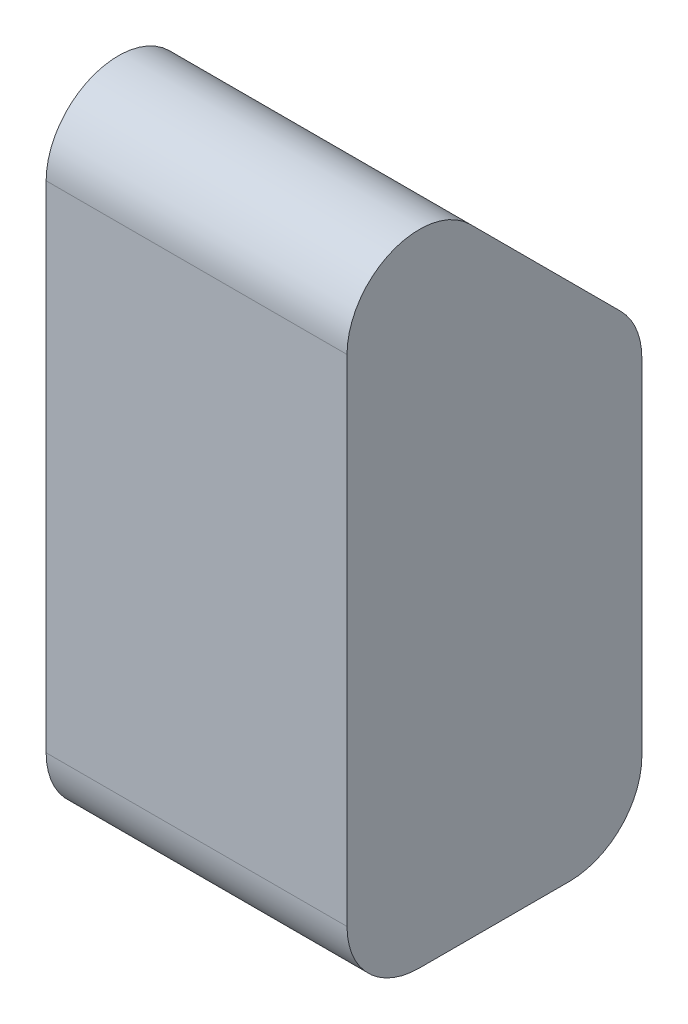
ISO-10303-21;
HEADER;
FILE_DESCRIPTION(('STEP AP214'),'2;1');
FILE_NAME('part.step','',(''),(''),'','','');
FILE_SCHEMA(('AUTOMOTIVE_DESIGN { 1 0 10303 214 1 1 1 1 }'));
ENDSEC;
DATA;
#1=APPLICATION_CONTEXT('core data for automotive mechanical design processes');
#2=APPLICATION_PROTOCOL_DEFINITION('international standard','automotive_design',2000,#1);
#3=PRODUCT_CONTEXT('',#1,'mechanical');
#4=PRODUCT('Part','Part','',(#3));
#5=PRODUCT_RELATED_PRODUCT_CATEGORY('part','',(#4));
#6=PRODUCT_DEFINITION_FORMATION('','',#4);
#7=PRODUCT_DEFINITION_CONTEXT('part definition',#1,'design');
#8=PRODUCT_DEFINITION('design','',#6,#7);
#9=PRODUCT_DEFINITION_SHAPE('','',#8);
#10=(LENGTH_UNIT() NAMED_UNIT(*) SI_UNIT(.MILLI.,.METRE.));
#11=(NAMED_UNIT(*) PLANE_ANGLE_UNIT() SI_UNIT($,.RADIAN.));
#12=(NAMED_UNIT(*) SI_UNIT($,.STERADIAN.) SOLID_ANGLE_UNIT());
#13=UNCERTAINTY_MEASURE_WITH_UNIT(LENGTH_MEASURE(1.E-05),#10,'distance_accuracy_value','');
#14=(GEOMETRIC_REPRESENTATION_CONTEXT(3) GLOBAL_UNCERTAINTY_ASSIGNED_CONTEXT((#13)) GLOBAL_UNIT_ASSIGNED_CONTEXT((#10,
#11,#12)) REPRESENTATION_CONTEXT('',''));
#15=CARTESIAN_POINT('',(0.,0.,0.));
#16=DIRECTION('',(0.,0.,1.));
#17=DIRECTION('',(1.,0.,0.));
#18=AXIS2_PLACEMENT_3D('',#15,#16,#17);
#19=CARTESIAN_POINT('',(-0.5,-2.60355339059327,3.25));
#20=DIRECTION('',(1.,0.,0.));
#21=DIRECTION('',(0.,0.,-1.));
#22=AXIS2_PLACEMENT_3D('',#19,#20,#21);
#23=CYLINDRICAL_SURFACE('',#22,0.24);
#24=DIRECTION('',(1.,0.,0.));
#25=VECTOR('',#24,1.);
#26=CARTESIAN_POINT('',(-0.5,-2.60355339059328,3.49));
#27=LINE('',#26,#25);
#28=CARTESIAN_POINT('',(-0.5,-2.60355339059328,3.49));
#29=VERTEX_POINT('',#28);
#30=CARTESIAN_POINT('',(0.5,-2.60355339059328,3.49));
#31=VERTEX_POINT('',#30);
#32=EDGE_CURVE('E42',#29,#31,#27,.T.);
#33=ORIENTED_EDGE('',*,*,#32,.T.);
#34=CARTESIAN_POINT('',(0.5,-2.60355339059327,3.25));
#35=DIRECTION('',(-1.,0.,0.));
#36=DIRECTION('',(0.,0.,1.));
#37=AXIS2_PLACEMENT_3D('',#34,#35,#36);
#38=CIRCLE('',#37,0.24);
#39=CARTESIAN_POINT('',(0.5,-2.43384776310851,3.08029437251522));
#40=VERTEX_POINT('',#39);
#41=EDGE_CURVE('E126',#31,#40,#38,.T.);
#42=ORIENTED_EDGE('',*,*,#41,.T.);
#43=DIRECTION('',(1.,0.,0.));
#44=VECTOR('',#43,1.);
#45=CARTESIAN_POINT('',(-0.5,-2.43384776310851,3.08029437251522));
#46=LINE('',#45,#44);
#47=CARTESIAN_POINT('',(-0.5,-2.43384776310851,3.08029437251522));
#48=VERTEX_POINT('',#47);
#49=EDGE_CURVE('E11',#48,#40,#46,.T.);
#50=ORIENTED_EDGE('',*,*,#49,.F.);
#51=CARTESIAN_POINT('',(-0.5,-2.60355339059327,3.25));
#52=DIRECTION('',(1.,0.,0.));
#53=DIRECTION('',(0.,0.,-1.));
#54=AXIS2_PLACEMENT_3D('',#51,#52,#53);
#55=CIRCLE('',#54,0.24);
#56=EDGE_CURVE('E127',#48,#29,#55,.T.);
#57=ORIENTED_EDGE('',*,*,#56,.T.);
#58=EDGE_LOOP('',(#33,#42,#50,#57));
#59=FACE_BOUND('',#58,.T.);
#60=ADVANCED_FACE('F41',(#59),#23,.T.);
#61=CARTESIAN_POINT('',(-0.5,-2.9338477631085,2.58029437251523));
#62=DIRECTION('',(0.,0.707106781186548,-0.707106781186547));
#63=DIRECTION('',(0.,0.707106781186547,0.707106781186548));
#64=AXIS2_PLACEMENT_3D('',#61,#62,#63);
#65=PLANE('',#64);
#66=ORIENTED_EDGE('',*,*,#49,.T.);
#67=DIRECTION('',(0.,-0.707106781186547,-0.707106781186548));
#68=VECTOR('',#67,1.);
#69=CARTESIAN_POINT('',(0.5,-2.9338477631085,2.58029437251523));
#70=LINE('',#69,#68);
#71=CARTESIAN_POINT('',(0.5,-2.9338477631085,2.58029437251523));
#72=VERTEX_POINT('',#71);
#73=EDGE_CURVE('E118',#40,#72,#70,.T.);
#74=ORIENTED_EDGE('',*,*,#73,.T.);
#75=DIRECTION('',(1.,0.,0.));
#76=VECTOR('',#75,1.);
#77=CARTESIAN_POINT('',(-0.5,-2.9338477631085,2.58029437251523));
#78=LINE('',#77,#76);
#79=CARTESIAN_POINT('',(-0.5,-2.9338477631085,2.58029437251523));
#80=VERTEX_POINT('',#79);
#81=EDGE_CURVE('E47',#80,#72,#78,.T.);
#82=ORIENTED_EDGE('',*,*,#81,.F.);
#83=DIRECTION('',(0.,0.707106781186547,0.707106781186548));
#84=VECTOR('',#83,1.);
#85=CARTESIAN_POINT('',(-0.5,-2.9338477631085,2.58029437251523));
#86=LINE('',#85,#84);
#87=EDGE_CURVE('E149',#80,#48,#86,.T.);
#88=ORIENTED_EDGE('',*,*,#87,.T.);
#89=EDGE_LOOP('',(#66,#74,#82,#88));
#90=FACE_BOUND('',#89,.T.);
#91=ADVANCED_FACE('F125',(#90),#65,.T.);
#92=CARTESIAN_POINT('',(-0.5,-3.10355339059327,2.75));
#93=DIRECTION('',(1.,0.,0.));
#94=DIRECTION('',(0.,0.,-1.));
#95=AXIS2_PLACEMENT_3D('',#92,#93,#94);
#96=CYLINDRICAL_SURFACE('',#95,0.24);
#97=ORIENTED_EDGE('',*,*,#81,.T.);
#98=CARTESIAN_POINT('',(0.5,-3.10355339059327,2.75));
#99=DIRECTION('',(-1.,0.,0.));
#100=DIRECTION('',(0.,0.,1.));
#101=AXIS2_PLACEMENT_3D('',#98,#99,#100);
#102=CIRCLE('',#101,0.24);
#103=CARTESIAN_POINT('',(0.5,-3.10355339059327,2.51));
#104=VERTEX_POINT('',#103);
#105=EDGE_CURVE('E107',#72,#104,#102,.T.);
#106=ORIENTED_EDGE('',*,*,#105,.T.);
#107=DIRECTION('',(1.,0.,0.));
#108=VECTOR('',#107,1.);
#109=CARTESIAN_POINT('',(-0.5,-3.10355339059327,2.51));
#110=LINE('',#109,#108);
#111=CARTESIAN_POINT('',(-0.5,-3.10355339059327,2.51));
#112=VERTEX_POINT('',#111);
#113=EDGE_CURVE('E112',#112,#104,#110,.T.);
#114=ORIENTED_EDGE('',*,*,#113,.F.);
#115=CARTESIAN_POINT('',(-0.5,-3.10355339059327,2.75));
#116=DIRECTION('',(1.,0.,0.));
#117=DIRECTION('',(0.,0.,-1.));
#118=AXIS2_PLACEMENT_3D('',#115,#116,#117);
#119=CIRCLE('',#118,0.24);
#120=EDGE_CURVE('E108',#112,#80,#119,.T.);
#121=ORIENTED_EDGE('',*,*,#120,.T.);
#122=EDGE_LOOP('',(#97,#106,#114,#121));
#123=FACE_BOUND('',#122,.T.);
#124=ADVANCED_FACE('F106',(#123),#96,.T.);
#125=CARTESIAN_POINT('',(-0.5,-4.25,2.51));
#126=DIRECTION('',(0.,0.,-1.));
#127=DIRECTION('',(0.,1.,0.));
#128=AXIS2_PLACEMENT_3D('',#125,#126,#127);
#129=PLANE('',#128);
#130=ORIENTED_EDGE('',*,*,#113,.T.);
#131=DIRECTION('',(0.,-1.,0.));
#132=VECTOR('',#131,1.);
#133=CARTESIAN_POINT('',(0.5,-4.25,2.51));
#134=LINE('',#133,#132);
#135=CARTESIAN_POINT('',(0.5,-4.25,2.51));
#136=VERTEX_POINT('',#135);
#137=EDGE_CURVE('E122',#104,#136,#134,.T.);
#138=ORIENTED_EDGE('',*,*,#137,.T.);
#139=DIRECTION('',(1.,0.,0.));
#140=VECTOR('',#139,1.);
#141=CARTESIAN_POINT('',(-0.5,-4.25,2.51));
#142=LINE('',#141,#140);
#143=CARTESIAN_POINT('',(-0.5,-4.25,2.51));
#144=VERTEX_POINT('',#143);
#145=EDGE_CURVE('E151',#144,#136,#142,.T.);
#146=ORIENTED_EDGE('',*,*,#145,.F.);
#147=DIRECTION('',(0.,1.,0.));
#148=VECTOR('',#147,1.);
#149=CARTESIAN_POINT('',(-0.5,-4.25,2.51));
#150=LINE('',#149,#148);
#151=EDGE_CURVE('E143',#144,#112,#150,.T.);
#152=ORIENTED_EDGE('',*,*,#151,.T.);
#153=EDGE_LOOP('',(#130,#138,#146,#152));
#154=FACE_BOUND('',#153,.T.);
#155=ADVANCED_FACE('F174',(#154),#129,.T.);
#156=CARTESIAN_POINT('',(-0.5,-4.25,2.75));
#157=DIRECTION('',(1.,0.,0.));
#158=DIRECTION('',(0.,0.,-1.));
#159=AXIS2_PLACEMENT_3D('',#156,#157,#158);
#160=CYLINDRICAL_SURFACE('',#159,0.24);
#161=ORIENTED_EDGE('',*,*,#145,.T.);
#162=CARTESIAN_POINT('',(0.5,-4.25,2.75));
#163=DIRECTION('',(-1.,0.,0.));
#164=DIRECTION('',(0.,0.,1.));
#165=AXIS2_PLACEMENT_3D('',#162,#163,#164);
#166=CIRCLE('',#165,0.24);
#167=CARTESIAN_POINT('',(0.5,-4.49,2.75));
#168=VERTEX_POINT('',#167);
#169=EDGE_CURVE('E169',#136,#168,#166,.T.);
#170=ORIENTED_EDGE('',*,*,#169,.T.);
#171=DIRECTION('',(1.,0.,0.));
#172=VECTOR('',#171,1.);
#173=CARTESIAN_POINT('',(-0.5,-4.49,2.75));
#174=LINE('',#173,#172);
#175=CARTESIAN_POINT('',(-0.5,-4.49,2.75));
#176=VERTEX_POINT('',#175);
#177=EDGE_CURVE('E154',#176,#168,#174,.T.);
#178=ORIENTED_EDGE('',*,*,#177,.F.);
#179=CARTESIAN_POINT('',(-0.5,-4.25,2.75));
#180=DIRECTION('',(1.,0.,0.));
#181=DIRECTION('',(0.,0.,-1.));
#182=AXIS2_PLACEMENT_3D('',#179,#180,#181);
#183=CIRCLE('',#182,0.24);
#184=EDGE_CURVE('E141',#176,#144,#183,.T.);
#185=ORIENTED_EDGE('',*,*,#184,.T.);
#186=EDGE_LOOP('',(#161,#170,#178,#185));
#187=FACE_BOUND('',#186,.T.);
#188=ADVANCED_FACE('F190',(#187),#160,.T.);
#189=CARTESIAN_POINT('',(-0.5,-4.49,3.25));
#190=DIRECTION('',(0.,-1.,0.));
#191=DIRECTION('',(0.,0.,-1.));
#192=AXIS2_PLACEMENT_3D('',#189,#190,#191);
#193=PLANE('',#192);
#194=ORIENTED_EDGE('',*,*,#177,.T.);
#195=DIRECTION('',(0.,0.,1.));
#196=VECTOR('',#195,1.);
#197=CARTESIAN_POINT('',(0.5,-4.49,3.25));
#198=LINE('',#197,#196);
#199=CARTESIAN_POINT('',(0.5,-4.49,3.25));
#200=VERTEX_POINT('',#199);
#201=EDGE_CURVE('E165',#168,#200,#198,.T.);
#202=ORIENTED_EDGE('',*,*,#201,.T.);
#203=DIRECTION('',(1.,0.,0.));
#204=VECTOR('',#203,1.);
#205=CARTESIAN_POINT('',(-0.5,-4.49,3.25));
#206=LINE('',#205,#204);
#207=CARTESIAN_POINT('',(-0.5,-4.49,3.25));
#208=VERTEX_POINT('',#207);
#209=EDGE_CURVE('E155',#208,#200,#206,.T.);
#210=ORIENTED_EDGE('',*,*,#209,.F.);
#211=DIRECTION('',(0.,0.,-1.));
#212=VECTOR('',#211,1.);
#213=CARTESIAN_POINT('',(-0.5,-4.49,3.25));
#214=LINE('',#213,#212);
#215=EDGE_CURVE('E138',#208,#176,#214,.T.);
#216=ORIENTED_EDGE('',*,*,#215,.T.);
#217=EDGE_LOOP('',(#194,#202,#210,#216));
#218=FACE_BOUND('',#217,.T.);
#219=ADVANCED_FACE('F184',(#218),#193,.T.);
#220=CARTESIAN_POINT('',(-0.5,-4.25,3.25));
#221=DIRECTION('',(1.,0.,0.));
#222=DIRECTION('',(0.,0.,-1.));
#223=AXIS2_PLACEMENT_3D('',#220,#221,#222);
#224=CYLINDRICAL_SURFACE('',#223,0.24);
#225=ORIENTED_EDGE('',*,*,#209,.T.);
#226=CARTESIAN_POINT('',(0.5,-4.25,3.25));
#227=DIRECTION('',(-1.,0.,0.));
#228=DIRECTION('',(0.,0.,1.));
#229=AXIS2_PLACEMENT_3D('',#226,#227,#228);
#230=CIRCLE('',#229,0.24);
#231=CARTESIAN_POINT('',(0.5,-4.25,3.49));
#232=VERTEX_POINT('',#231);
#233=EDGE_CURVE('E163',#200,#232,#230,.T.);
#234=ORIENTED_EDGE('',*,*,#233,.T.);
#235=DIRECTION('',(1.,0.,0.));
#236=VECTOR('',#235,1.);
#237=CARTESIAN_POINT('',(-0.5,-4.25,3.49));
#238=LINE('',#237,#236);
#239=CARTESIAN_POINT('',(-0.5,-4.25,3.49));
#240=VERTEX_POINT('',#239);
#241=EDGE_CURVE('E157',#240,#232,#238,.T.);
#242=ORIENTED_EDGE('',*,*,#241,.F.);
#243=CARTESIAN_POINT('',(-0.5,-4.25,3.25));
#244=DIRECTION('',(1.,0.,0.));
#245=DIRECTION('',(0.,0.,-1.));
#246=AXIS2_PLACEMENT_3D('',#243,#244,#245);
#247=CIRCLE('',#246,0.24);
#248=EDGE_CURVE('E134',#240,#208,#247,.T.);
#249=ORIENTED_EDGE('',*,*,#248,.T.);
#250=EDGE_LOOP('',(#225,#234,#242,#249));
#251=FACE_BOUND('',#250,.T.);
#252=ADVANCED_FACE('F185',(#251),#224,.T.);
#253=CARTESIAN_POINT('',(-0.5,-2.60355339059328,3.49));
#254=DIRECTION('',(0.,0.,1.));
#255=DIRECTION('',(0.,-1.,0.));
#256=AXIS2_PLACEMENT_3D('',#253,#254,#255);
#257=PLANE('',#256);
#258=ORIENTED_EDGE('',*,*,#241,.T.);
#259=DIRECTION('',(0.,1.,0.));
#260=VECTOR('',#259,1.);
#261=CARTESIAN_POINT('',(0.5,-2.60355339059328,3.49));
#262=LINE('',#261,#260);
#263=EDGE_CURVE('E161',#232,#31,#262,.T.);
#264=ORIENTED_EDGE('',*,*,#263,.T.);
#265=ORIENTED_EDGE('',*,*,#32,.F.);
#266=DIRECTION('',(0.,-1.,0.));
#267=VECTOR('',#266,1.);
#268=CARTESIAN_POINT('',(-0.5,-2.60355339059328,3.49));
#269=LINE('',#268,#267);
#270=EDGE_CURVE('E135',#29,#240,#269,.T.);
#271=ORIENTED_EDGE('',*,*,#270,.T.);
#272=EDGE_LOOP('',(#258,#264,#265,#271));
#273=FACE_BOUND('',#272,.T.);
#274=ADVANCED_FACE('F164',(#273),#257,.T.);
#275=CARTESIAN_POINT('',(-0.5,-2.60355339059327,3.25));
#276=DIRECTION('',(1.,0.,0.));
#277=DIRECTION('',(0.,0.,-1.));
#278=AXIS2_PLACEMENT_3D('',#275,#276,#277);
#279=PLANE('',#278);
#280=ORIENTED_EDGE('',*,*,#56,.F.);
#281=ORIENTED_EDGE('',*,*,#87,.F.);
#282=ORIENTED_EDGE('',*,*,#120,.F.);
#283=ORIENTED_EDGE('',*,*,#151,.F.);
#284=ORIENTED_EDGE('',*,*,#184,.F.);
#285=ORIENTED_EDGE('',*,*,#215,.F.);
#286=ORIENTED_EDGE('',*,*,#248,.F.);
#287=ORIENTED_EDGE('',*,*,#270,.F.);
#288=EDGE_LOOP('',(#280,#281,#282,#283,#284,#285,#286,#287));
#289=FACE_BOUND('',#288,.T.);
#290=ADVANCED_FACE('F180',(#289),#279,.F.);
#291=CARTESIAN_POINT('',(0.5,-8.00000000000001,4.));
#292=DIRECTION('',(-1.,0.,0.));
#293=DIRECTION('',(0.,0.,1.));
#294=AXIS2_PLACEMENT_3D('',#291,#292,#293);
#295=PLANE('',#294);
#296=ORIENTED_EDGE('',*,*,#263,.F.);
#297=ORIENTED_EDGE('',*,*,#233,.F.);
#298=ORIENTED_EDGE('',*,*,#201,.F.);
#299=ORIENTED_EDGE('',*,*,#169,.F.);
#300=ORIENTED_EDGE('',*,*,#137,.F.);
#301=ORIENTED_EDGE('',*,*,#105,.F.);
#302=ORIENTED_EDGE('',*,*,#73,.F.);
#303=ORIENTED_EDGE('',*,*,#41,.F.);
#304=EDGE_LOOP('',(#296,#297,#298,#299,#300,#301,#302,#303));
#305=FACE_BOUND('',#304,.T.);
#306=ADVANCED_FACE('F117',(#305),#295,.F.);
#307=CLOSED_SHELL('',(#60,#91,#124,#155,#188,#219,#252,#274,#290,#306));
#308=MANIFOLD_SOLID_BREP('B2',#307);
#309=ADVANCED_BREP_SHAPE_REPRESENTATION('',(#18,#308),#14);
#310=SHAPE_DEFINITION_REPRESENTATION(#9,#309);
ENDSEC;
END-ISO-10303-21;
